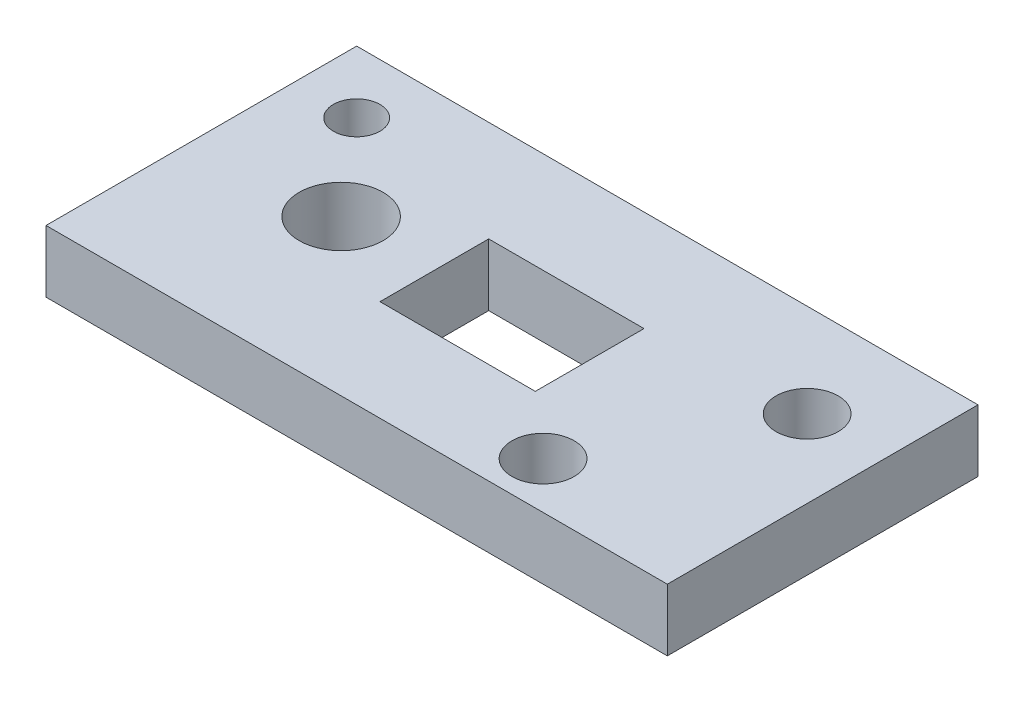
ISO-10303-21;
HEADER;
FILE_DESCRIPTION(('STEP AP214'),'2;1');
FILE_NAME('part.step','',(''),(''),'','','');
FILE_SCHEMA(('AUTOMOTIVE_DESIGN { 1 0 10303 214 1 1 1 1 }'));
ENDSEC;
DATA;
#1=APPLICATION_CONTEXT('core data for automotive mechanical design processes');
#2=APPLICATION_PROTOCOL_DEFINITION('international standard','automotive_design',2000,#1);
#3=PRODUCT_CONTEXT('',#1,'mechanical');
#4=PRODUCT('Part','Part','',(#3));
#5=PRODUCT_RELATED_PRODUCT_CATEGORY('part','',(#4));
#6=PRODUCT_DEFINITION_FORMATION('','',#4);
#7=PRODUCT_DEFINITION_CONTEXT('part definition',#1,'design');
#8=PRODUCT_DEFINITION('design','',#6,#7);
#9=PRODUCT_DEFINITION_SHAPE('','',#8);
#10=(LENGTH_UNIT() NAMED_UNIT(*) SI_UNIT(.MILLI.,.METRE.));
#11=(NAMED_UNIT(*) PLANE_ANGLE_UNIT() SI_UNIT($,.RADIAN.));
#12=(NAMED_UNIT(*) SI_UNIT($,.STERADIAN.) SOLID_ANGLE_UNIT());
#13=UNCERTAINTY_MEASURE_WITH_UNIT(LENGTH_MEASURE(1.E-05),#10,'distance_accuracy_value','');
#14=(GEOMETRIC_REPRESENTATION_CONTEXT(3) GLOBAL_UNCERTAINTY_ASSIGNED_CONTEXT((#13)) GLOBAL_UNIT_ASSIGNED_CONTEXT((#10,
#11,#12)) REPRESENTATION_CONTEXT('',''));
#15=CARTESIAN_POINT('',(0.,0.,0.));
#16=DIRECTION('',(0.,0.,1.));
#17=DIRECTION('',(1.,0.,0.));
#18=AXIS2_PLACEMENT_3D('',#15,#16,#17);
#19=CARTESIAN_POINT('',(100.,10.,-50.));
#20=DIRECTION('',(-1.,0.,0.));
#21=DIRECTION('',(0.,0.,1.));
#22=AXIS2_PLACEMENT_3D('',#19,#20,#21);
#23=PLANE('',#22);
#24=DIRECTION('',(0.,0.,-1.));
#25=VECTOR('',#24,1.);
#26=CARTESIAN_POINT('',(100.,-10.,-50.));
#27=LINE('',#26,#25);
#28=CARTESIAN_POINT('',(100.,-10.,50.));
#29=VERTEX_POINT('',#28);
#30=CARTESIAN_POINT('',(100.,-10.,-50.));
#31=VERTEX_POINT('',#30);
#32=EDGE_CURVE('E158',#29,#31,#27,.T.);
#33=ORIENTED_EDGE('',*,*,#32,.T.);
#34=DIRECTION('',(0.,-1.,0.));
#35=VECTOR('',#34,1.);
#36=CARTESIAN_POINT('',(100.,10.,-50.));
#37=LINE('',#36,#35);
#38=CARTESIAN_POINT('',(100.,10.,-50.));
#39=VERTEX_POINT('',#38);
#40=EDGE_CURVE('E11',#39,#31,#37,.T.);
#41=ORIENTED_EDGE('',*,*,#40,.F.);
#42=DIRECTION('',(0.,0.,-1.));
#43=VECTOR('',#42,1.);
#44=CARTESIAN_POINT('',(100.,10.,-50.));
#45=LINE('',#44,#43);
#46=CARTESIAN_POINT('',(100.,10.,50.));
#47=VERTEX_POINT('',#46);
#48=EDGE_CURVE('E164',#47,#39,#45,.T.);
#49=ORIENTED_EDGE('',*,*,#48,.F.);
#50=DIRECTION('',(0.,-1.,0.));
#51=VECTOR('',#50,1.);
#52=CARTESIAN_POINT('',(100.,10.,50.));
#53=LINE('',#52,#51);
#54=EDGE_CURVE('E178',#47,#29,#53,.T.);
#55=ORIENTED_EDGE('',*,*,#54,.T.);
#56=EDGE_LOOP('',(#33,#41,#49,#55));
#57=FACE_BOUND('',#56,.T.);
#58=ADVANCED_FACE('F45',(#57),#23,.F.);
#59=CARTESIAN_POINT('',(-100.,10.,-50.));
#60=DIRECTION('',(0.,0.,1.));
#61=DIRECTION('',(1.,0.,0.));
#62=AXIS2_PLACEMENT_3D('',#59,#60,#61);
#63=PLANE('',#62);
#64=DIRECTION('',(-1.,0.,0.));
#65=VECTOR('',#64,1.);
#66=CARTESIAN_POINT('',(-100.,-10.,-50.));
#67=LINE('',#66,#65);
#68=CARTESIAN_POINT('',(-100.,-10.,-50.));
#69=VERTEX_POINT('',#68);
#70=EDGE_CURVE('E182',#31,#69,#67,.T.);
#71=ORIENTED_EDGE('',*,*,#70,.T.);
#72=DIRECTION('',(0.,-1.,0.));
#73=VECTOR('',#72,1.);
#74=CARTESIAN_POINT('',(-100.,10.,-50.));
#75=LINE('',#74,#73);
#76=CARTESIAN_POINT('',(-100.,10.,-50.));
#77=VERTEX_POINT('',#76);
#78=EDGE_CURVE('E53',#77,#69,#75,.T.);
#79=ORIENTED_EDGE('',*,*,#78,.F.);
#80=DIRECTION('',(-1.,0.,0.));
#81=VECTOR('',#80,1.);
#82=CARTESIAN_POINT('',(-100.,10.,-50.));
#83=LINE('',#82,#81);
#84=EDGE_CURVE('E168',#39,#77,#83,.T.);
#85=ORIENTED_EDGE('',*,*,#84,.F.);
#86=ORIENTED_EDGE('',*,*,#40,.T.);
#87=EDGE_LOOP('',(#71,#79,#85,#86));
#88=FACE_BOUND('',#87,.T.);
#89=ADVANCED_FACE('F217',(#88),#63,.F.);
#90=CARTESIAN_POINT('',(-100.,10.,-50.));
#91=DIRECTION('',(1.,0.,0.));
#92=DIRECTION('',(0.,0.,-1.));
#93=AXIS2_PLACEMENT_3D('',#90,#91,#92);
#94=PLANE('',#93);
#95=DIRECTION('',(0.,0.,1.));
#96=VECTOR('',#95,1.);
#97=CARTESIAN_POINT('',(-100.,-10.,-50.));
#98=LINE('',#97,#96);
#99=CARTESIAN_POINT('',(-100.,-10.,50.));
#100=VERTEX_POINT('',#99);
#101=EDGE_CURVE('E185',#69,#100,#98,.T.);
#102=ORIENTED_EDGE('',*,*,#101,.T.);
#103=DIRECTION('',(0.,-1.,0.));
#104=VECTOR('',#103,1.);
#105=CARTESIAN_POINT('',(-100.,10.,50.));
#106=LINE('',#105,#104);
#107=CARTESIAN_POINT('',(-100.,10.,50.));
#108=VERTEX_POINT('',#107);
#109=EDGE_CURVE('E193',#108,#100,#106,.T.);
#110=ORIENTED_EDGE('',*,*,#109,.F.);
#111=DIRECTION('',(0.,0.,1.));
#112=VECTOR('',#111,1.);
#113=CARTESIAN_POINT('',(-100.,10.,-50.));
#114=LINE('',#113,#112);
#115=EDGE_CURVE('E172',#77,#108,#114,.T.);
#116=ORIENTED_EDGE('',*,*,#115,.F.);
#117=ORIENTED_EDGE('',*,*,#78,.T.);
#118=EDGE_LOOP('',(#102,#110,#116,#117));
#119=FACE_BOUND('',#118,.T.);
#120=ADVANCED_FACE('F203',(#119),#94,.F.);
#121=CARTESIAN_POINT('',(-100.,10.,50.));
#122=DIRECTION('',(0.,0.,-1.));
#123=DIRECTION('',(-1.,0.,0.));
#124=AXIS2_PLACEMENT_3D('',#121,#122,#123);
#125=PLANE('',#124);
#126=DIRECTION('',(1.,0.,0.));
#127=VECTOR('',#126,1.);
#128=CARTESIAN_POINT('',(-100.,-10.,50.));
#129=LINE('',#128,#127);
#130=EDGE_CURVE('E169',#100,#29,#129,.T.);
#131=ORIENTED_EDGE('',*,*,#130,.T.);
#132=ORIENTED_EDGE('',*,*,#54,.F.);
#133=DIRECTION('',(1.,0.,0.));
#134=VECTOR('',#133,1.);
#135=CARTESIAN_POINT('',(-100.,10.,50.));
#136=LINE('',#135,#134);
#137=EDGE_CURVE('E175',#108,#47,#136,.T.);
#138=ORIENTED_EDGE('',*,*,#137,.F.);
#139=ORIENTED_EDGE('',*,*,#109,.T.);
#140=EDGE_LOOP('',(#131,#132,#138,#139));
#141=FACE_BOUND('',#140,.T.);
#142=ADVANCED_FACE('F210',(#141),#125,.F.);
#143=CARTESIAN_POINT('',(0.,10.,0.));
#144=DIRECTION('',(0.,1.,0.));
#145=DIRECTION('',(0.,0.,1.));
#146=AXIS2_PLACEMENT_3D('',#143,#144,#145);
#147=PLANE('',#146);
#148=CARTESIAN_POINT('',(45.,10.,35.));
#149=DIRECTION('',(0.,1.,0.));
#150=DIRECTION('',(0.,0.,1.));
#151=AXIS2_PLACEMENT_3D('',#148,#149,#150);
#152=CIRCLE('',#151,10.);
#153=CARTESIAN_POINT('',(45.,10.,45.));
#154=VERTEX_POINT('',#153);
#155=EDGE_CURVE('E139',#154,#154,#152,.T.);
#156=ORIENTED_EDGE('',*,*,#155,.F.);
#157=EDGE_LOOP('',(#156));
#158=FACE_BOUND('',#157,.T.);
#159=CARTESIAN_POINT('',(75.,10.,-20.));
#160=DIRECTION('',(0.,1.,0.));
#161=DIRECTION('',(0.,0.,1.));
#162=AXIS2_PLACEMENT_3D('',#159,#160,#161);
#163=CIRCLE('',#162,9.99999999999999);
#164=CARTESIAN_POINT('',(75.,10.,-10.));
#165=VERTEX_POINT('',#164);
#166=EDGE_CURVE('E286',#165,#165,#163,.T.);
#167=ORIENTED_EDGE('',*,*,#166,.F.);
#168=EDGE_LOOP('',(#167));
#169=FACE_BOUND('',#168,.T.);
#170=CARTESIAN_POINT('',(-55.,10.,0.));
#171=DIRECTION('',(0.,1.,0.));
#172=DIRECTION('',(0.,0.,1.));
#173=AXIS2_PLACEMENT_3D('',#170,#171,#172);
#174=CIRCLE('',#173,13.5);
#175=CARTESIAN_POINT('',(-55.,10.,13.5));
#176=VERTEX_POINT('',#175);
#177=EDGE_CURVE('E276',#176,#176,#174,.T.);
#178=ORIENTED_EDGE('',*,*,#177,.F.);
#179=EDGE_LOOP('',(#178));
#180=FACE_BOUND('',#179,.T.);
#181=CARTESIAN_POINT('',(-80.,10.,-30.));
#182=DIRECTION('',(0.,1.,0.));
#183=DIRECTION('',(0.,0.,1.));
#184=AXIS2_PLACEMENT_3D('',#181,#182,#183);
#185=CIRCLE('',#184,7.50000000000001);
#186=CARTESIAN_POINT('',(-80.,10.,-22.5));
#187=VERTEX_POINT('',#186);
#188=EDGE_CURVE('E266',#187,#187,#185,.T.);
#189=ORIENTED_EDGE('',*,*,#188,.F.);
#190=EDGE_LOOP('',(#189));
#191=FACE_BOUND('',#190,.T.);
#192=DIRECTION('',(0.,0.,-1.));
#193=VECTOR('',#192,1.);
#194=CARTESIAN_POINT('',(25.,10.,-17.5));
#195=LINE('',#194,#193);
#196=CARTESIAN_POINT('',(25.,10.,17.5));
#197=VERTEX_POINT('',#196);
#198=CARTESIAN_POINT('',(25.,10.,-17.5));
#199=VERTEX_POINT('',#198);
#200=EDGE_CURVE('E60',#197,#199,#195,.T.);
#201=ORIENTED_EDGE('',*,*,#200,.F.);
#202=DIRECTION('',(1.,0.,0.));
#203=VECTOR('',#202,1.);
#204=CARTESIAN_POINT('',(-25.,10.,17.5));
#205=LINE('',#204,#203);
#206=CARTESIAN_POINT('',(-25.,10.,17.5));
#207=VERTEX_POINT('',#206);
#208=EDGE_CURVE('E131',#207,#197,#205,.T.);
#209=ORIENTED_EDGE('',*,*,#208,.F.);
#210=DIRECTION('',(0.,0.,1.));
#211=VECTOR('',#210,1.);
#212=CARTESIAN_POINT('',(-25.,10.,-17.5));
#213=LINE('',#212,#211);
#214=CARTESIAN_POINT('',(-25.,10.,-17.5));
#215=VERTEX_POINT('',#214);
#216=EDGE_CURVE('E136',#215,#207,#213,.T.);
#217=ORIENTED_EDGE('',*,*,#216,.F.);
#218=DIRECTION('',(-1.,0.,0.));
#219=VECTOR('',#218,1.);
#220=CARTESIAN_POINT('',(-25.,10.,-17.5));
#221=LINE('',#220,#219);
#222=EDGE_CURVE('E148',#199,#215,#221,.T.);
#223=ORIENTED_EDGE('',*,*,#222,.F.);
#224=EDGE_LOOP('',(#201,#209,#217,#223));
#225=FACE_BOUND('',#224,.T.);
#226=ORIENTED_EDGE('',*,*,#48,.T.);
#227=ORIENTED_EDGE('',*,*,#84,.T.);
#228=ORIENTED_EDGE('',*,*,#115,.T.);
#229=ORIENTED_EDGE('',*,*,#137,.T.);
#230=EDGE_LOOP('',(#226,#227,#228,#229));
#231=FACE_BOUND('',#230,.T.);
#232=ADVANCED_FACE('F216',(#158,#169,#180,#191,#225,#231),#147,.T.);
#233=CARTESIAN_POINT('',(0.,-10.,0.));
#234=DIRECTION('',(0.,1.,0.));
#235=DIRECTION('',(0.,0.,1.));
#236=AXIS2_PLACEMENT_3D('',#233,#234,#235);
#237=PLANE('',#236);
#238=CARTESIAN_POINT('',(45.,-10.,35.));
#239=DIRECTION('',(0.,1.,0.));
#240=DIRECTION('',(0.,0.,1.));
#241=AXIS2_PLACEMENT_3D('',#238,#239,#240);
#242=CIRCLE('',#241,10.);
#243=CARTESIAN_POINT('',(45.,-10.,45.));
#244=VERTEX_POINT('',#243);
#245=EDGE_CURVE('E289',#244,#244,#242,.T.);
#246=ORIENTED_EDGE('',*,*,#245,.T.);
#247=EDGE_LOOP('',(#246));
#248=FACE_BOUND('',#247,.T.);
#249=CARTESIAN_POINT('',(75.,-10.,-20.));
#250=DIRECTION('',(0.,1.,0.));
#251=DIRECTION('',(0.,0.,1.));
#252=AXIS2_PLACEMENT_3D('',#249,#250,#251);
#253=CIRCLE('',#252,9.99999999999999);
#254=CARTESIAN_POINT('',(75.,-10.,-10.));
#255=VERTEX_POINT('',#254);
#256=EDGE_CURVE('E282',#255,#255,#253,.T.);
#257=ORIENTED_EDGE('',*,*,#256,.T.);
#258=EDGE_LOOP('',(#257));
#259=FACE_BOUND('',#258,.T.);
#260=CARTESIAN_POINT('',(-55.,-10.,0.));
#261=DIRECTION('',(0.,1.,0.));
#262=DIRECTION('',(0.,0.,1.));
#263=AXIS2_PLACEMENT_3D('',#260,#261,#262);
#264=CIRCLE('',#263,13.5);
#265=CARTESIAN_POINT('',(-55.,-10.,13.5));
#266=VERTEX_POINT('',#265);
#267=EDGE_CURVE('E269',#266,#266,#264,.T.);
#268=ORIENTED_EDGE('',*,*,#267,.T.);
#269=EDGE_LOOP('',(#268));
#270=FACE_BOUND('',#269,.T.);
#271=CARTESIAN_POINT('',(-80.,-10.,-30.));
#272=DIRECTION('',(0.,1.,0.));
#273=DIRECTION('',(0.,0.,1.));
#274=AXIS2_PLACEMENT_3D('',#271,#272,#273);
#275=CIRCLE('',#274,7.50000000000001);
#276=CARTESIAN_POINT('',(-80.,-10.,-22.5));
#277=VERTEX_POINT('',#276);
#278=EDGE_CURVE('E149',#277,#277,#275,.T.);
#279=ORIENTED_EDGE('',*,*,#278,.T.);
#280=EDGE_LOOP('',(#279));
#281=FACE_BOUND('',#280,.T.);
#282=DIRECTION('',(1.,0.,0.));
#283=VECTOR('',#282,1.);
#284=CARTESIAN_POINT('',(-25.,-10.,17.5));
#285=LINE('',#284,#283);
#286=CARTESIAN_POINT('',(-25.,-10.,17.5));
#287=VERTEX_POINT('',#286);
#288=CARTESIAN_POINT('',(25.,-10.,17.5));
#289=VERTEX_POINT('',#288);
#290=EDGE_CURVE('E119',#287,#289,#285,.T.);
#291=ORIENTED_EDGE('',*,*,#290,.T.);
#292=DIRECTION('',(0.,0.,-1.));
#293=VECTOR('',#292,1.);
#294=CARTESIAN_POINT('',(25.,-10.,-17.5));
#295=LINE('',#294,#293);
#296=CARTESIAN_POINT('',(25.,-10.,-17.5));
#297=VERTEX_POINT('',#296);
#298=EDGE_CURVE('E112',#289,#297,#295,.T.);
#299=ORIENTED_EDGE('',*,*,#298,.T.);
#300=DIRECTION('',(-1.,0.,0.));
#301=VECTOR('',#300,1.);
#302=CARTESIAN_POINT('',(-25.,-10.,-17.5));
#303=LINE('',#302,#301);
#304=CARTESIAN_POINT('',(-25.,-10.,-17.5));
#305=VERTEX_POINT('',#304);
#306=EDGE_CURVE('E122',#297,#305,#303,.T.);
#307=ORIENTED_EDGE('',*,*,#306,.T.);
#308=DIRECTION('',(0.,0.,1.));
#309=VECTOR('',#308,1.);
#310=CARTESIAN_POINT('',(-25.,-10.,-17.5));
#311=LINE('',#310,#309);
#312=EDGE_CURVE('E68',#305,#287,#311,.T.);
#313=ORIENTED_EDGE('',*,*,#312,.T.);
#314=EDGE_LOOP('',(#291,#299,#307,#313));
#315=FACE_BOUND('',#314,.T.);
#316=ORIENTED_EDGE('',*,*,#32,.F.);
#317=ORIENTED_EDGE('',*,*,#130,.F.);
#318=ORIENTED_EDGE('',*,*,#101,.F.);
#319=ORIENTED_EDGE('',*,*,#70,.F.);
#320=EDGE_LOOP('',(#316,#317,#318,#319));
#321=FACE_BOUND('',#320,.T.);
#322=ADVANCED_FACE('F127',(#248,#259,#270,#281,#315,#321),#237,.F.);
#323=CARTESIAN_POINT('',(25.,-10.,-17.5));
#324=DIRECTION('',(1.,0.,0.));
#325=DIRECTION('',(0.,0.,-1.));
#326=AXIS2_PLACEMENT_3D('',#323,#324,#325);
#327=PLANE('',#326);
#328=ORIENTED_EDGE('',*,*,#200,.T.);
#329=DIRECTION('',(0.,1.,0.));
#330=VECTOR('',#329,1.);
#331=CARTESIAN_POINT('',(25.,-10.,-17.5));
#332=LINE('',#331,#330);
#333=EDGE_CURVE('E108',#297,#199,#332,.T.);
#334=ORIENTED_EDGE('',*,*,#333,.F.);
#335=ORIENTED_EDGE('',*,*,#298,.F.);
#336=DIRECTION('',(0.,1.,0.));
#337=VECTOR('',#336,1.);
#338=CARTESIAN_POINT('',(25.,-10.,17.5));
#339=LINE('',#338,#337);
#340=EDGE_CURVE('E155',#289,#197,#339,.T.);
#341=ORIENTED_EDGE('',*,*,#340,.T.);
#342=EDGE_LOOP('',(#328,#334,#335,#341));
#343=FACE_BOUND('',#342,.T.);
#344=ADVANCED_FACE('F110',(#343),#327,.F.);
#345=CARTESIAN_POINT('',(-25.,-10.,17.5));
#346=DIRECTION('',(0.,0.,1.));
#347=DIRECTION('',(1.,0.,0.));
#348=AXIS2_PLACEMENT_3D('',#345,#346,#347);
#349=PLANE('',#348);
#350=ORIENTED_EDGE('',*,*,#208,.T.);
#351=ORIENTED_EDGE('',*,*,#340,.F.);
#352=ORIENTED_EDGE('',*,*,#290,.F.);
#353=DIRECTION('',(0.,1.,0.));
#354=VECTOR('',#353,1.);
#355=CARTESIAN_POINT('',(-25.,-10.,17.5));
#356=LINE('',#355,#354);
#357=EDGE_CURVE('E159',#287,#207,#356,.T.);
#358=ORIENTED_EDGE('',*,*,#357,.T.);
#359=EDGE_LOOP('',(#350,#351,#352,#358));
#360=FACE_BOUND('',#359,.T.);
#361=ADVANCED_FACE('F235',(#360),#349,.F.);
#362=CARTESIAN_POINT('',(-25.,-10.,-17.5));
#363=DIRECTION('',(-1.,0.,0.));
#364=DIRECTION('',(0.,0.,1.));
#365=AXIS2_PLACEMENT_3D('',#362,#363,#364);
#366=PLANE('',#365);
#367=ORIENTED_EDGE('',*,*,#216,.T.);
#368=ORIENTED_EDGE('',*,*,#357,.F.);
#369=ORIENTED_EDGE('',*,*,#312,.F.);
#370=DIRECTION('',(0.,1.,0.));
#371=VECTOR('',#370,1.);
#372=CARTESIAN_POINT('',(-25.,-10.,-17.5));
#373=LINE('',#372,#371);
#374=EDGE_CURVE('E118',#305,#215,#373,.T.);
#375=ORIENTED_EDGE('',*,*,#374,.T.);
#376=EDGE_LOOP('',(#367,#368,#369,#375));
#377=FACE_BOUND('',#376,.T.);
#378=ADVANCED_FACE('F239',(#377),#366,.F.);
#379=CARTESIAN_POINT('',(-25.,-10.,-17.5));
#380=DIRECTION('',(0.,0.,-1.));
#381=DIRECTION('',(-1.,0.,0.));
#382=AXIS2_PLACEMENT_3D('',#379,#380,#381);
#383=PLANE('',#382);
#384=ORIENTED_EDGE('',*,*,#222,.T.);
#385=ORIENTED_EDGE('',*,*,#374,.F.);
#386=ORIENTED_EDGE('',*,*,#306,.F.);
#387=ORIENTED_EDGE('',*,*,#333,.T.);
#388=EDGE_LOOP('',(#384,#385,#386,#387));
#389=FACE_BOUND('',#388,.T.);
#390=ADVANCED_FACE('F123',(#389),#383,.F.);
#391=CARTESIAN_POINT('',(-80.,-10.,-30.));
#392=DIRECTION('',(0.,1.,0.));
#393=DIRECTION('',(0.,0.,1.));
#394=AXIS2_PLACEMENT_3D('',#391,#392,#393);
#395=CYLINDRICAL_SURFACE('',#394,7.50000000000001);
#396=ORIENTED_EDGE('',*,*,#278,.F.);
#397=EDGE_LOOP('',(#396));
#398=FACE_BOUND('',#397,.T.);
#399=ORIENTED_EDGE('',*,*,#188,.T.);
#400=EDGE_LOOP('',(#399));
#401=FACE_BOUND('',#400,.T.);
#402=ADVANCED_FACE('F238',(#398,#401),#395,.F.);
#403=CARTESIAN_POINT('',(-55.,-10.,0.));
#404=DIRECTION('',(0.,1.,0.));
#405=DIRECTION('',(0.,0.,1.));
#406=AXIS2_PLACEMENT_3D('',#403,#404,#405);
#407=CYLINDRICAL_SURFACE('',#406,13.5);
#408=ORIENTED_EDGE('',*,*,#267,.F.);
#409=EDGE_LOOP('',(#408));
#410=FACE_BOUND('',#409,.T.);
#411=ORIENTED_EDGE('',*,*,#177,.T.);
#412=EDGE_LOOP('',(#411));
#413=FACE_BOUND('',#412,.T.);
#414=ADVANCED_FACE('F252',(#410,#413),#407,.F.);
#415=CARTESIAN_POINT('',(75.,-10.,-20.));
#416=DIRECTION('',(0.,1.,0.));
#417=DIRECTION('',(0.,0.,1.));
#418=AXIS2_PLACEMENT_3D('',#415,#416,#417);
#419=CYLINDRICAL_SURFACE('',#418,9.99999999999999);
#420=ORIENTED_EDGE('',*,*,#256,.F.);
#421=EDGE_LOOP('',(#420));
#422=FACE_BOUND('',#421,.T.);
#423=ORIENTED_EDGE('',*,*,#166,.T.);
#424=EDGE_LOOP('',(#423));
#425=FACE_BOUND('',#424,.T.);
#426=ADVANCED_FACE('F248',(#422,#425),#419,.F.);
#427=CARTESIAN_POINT('',(45.,-10.,35.));
#428=DIRECTION('',(0.,1.,0.));
#429=DIRECTION('',(0.,0.,1.));
#430=AXIS2_PLACEMENT_3D('',#427,#428,#429);
#431=CYLINDRICAL_SURFACE('',#430,10.);
#432=ORIENTED_EDGE('',*,*,#245,.F.);
#433=EDGE_LOOP('',(#432));
#434=FACE_BOUND('',#433,.T.);
#435=ORIENTED_EDGE('',*,*,#155,.T.);
#436=EDGE_LOOP('',(#435));
#437=FACE_BOUND('',#436,.T.);
#438=ADVANCED_FACE('F245',(#434,#437),#431,.F.);
#439=CLOSED_SHELL('',(#58,#89,#120,#142,#232,#322,#344,#361,#378,#390,#402,#414,#426,#438));
#440=MANIFOLD_SOLID_BREP('B2',#439);
#441=ADVANCED_BREP_SHAPE_REPRESENTATION('',(#18,#440),#14);
#442=SHAPE_DEFINITION_REPRESENTATION(#9,#441);
ENDSEC;
END-ISO-10303-21;
